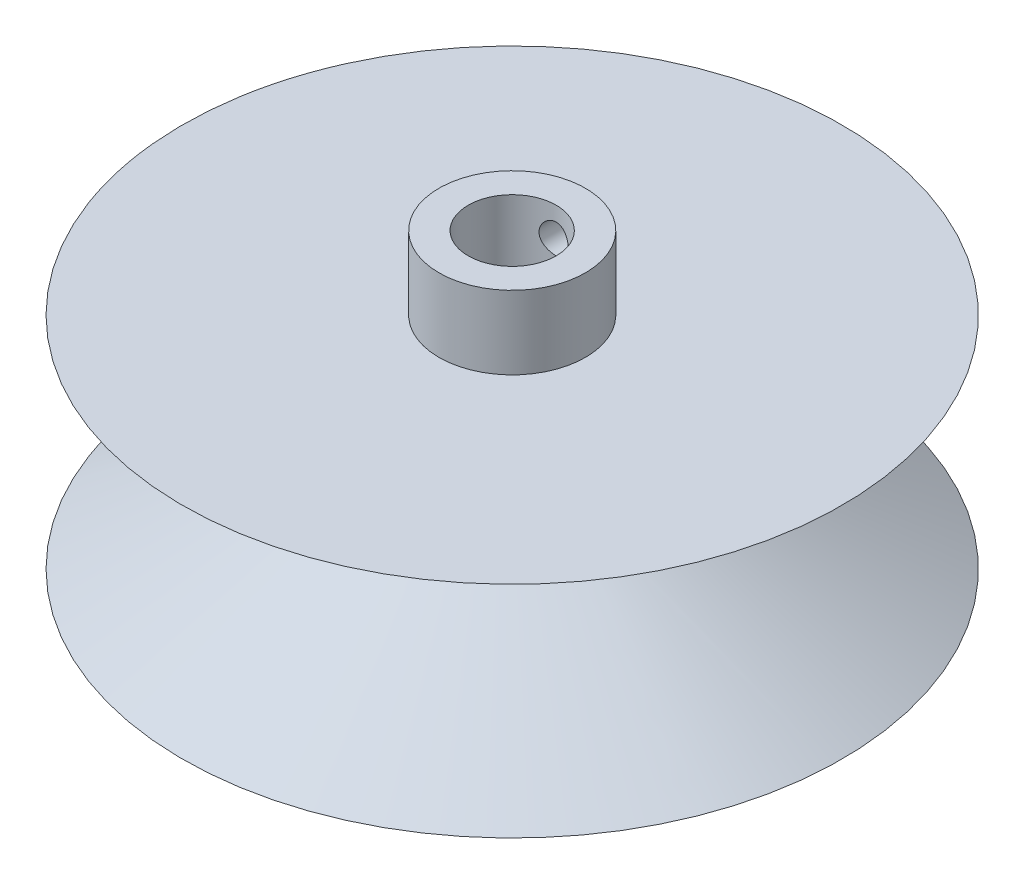
ISO-10303-21;
HEADER;
FILE_DESCRIPTION(('STEP AP214'),'2;1');
FILE_NAME('part.step','',(''),(''),'','','');
FILE_SCHEMA(('AUTOMOTIVE_DESIGN { 1 0 10303 214 1 1 1 1 }'));
ENDSEC;
DATA;
#1=APPLICATION_CONTEXT('core data for automotive mechanical design processes');
#2=APPLICATION_PROTOCOL_DEFINITION('international standard','automotive_design',2000,#1);
#3=PRODUCT_CONTEXT('',#1,'mechanical');
#4=PRODUCT('Part','Part','',(#3));
#5=PRODUCT_RELATED_PRODUCT_CATEGORY('part','',(#4));
#6=PRODUCT_DEFINITION_FORMATION('','',#4);
#7=PRODUCT_DEFINITION_CONTEXT('part definition',#1,'design');
#8=PRODUCT_DEFINITION('design','',#6,#7);
#9=PRODUCT_DEFINITION_SHAPE('','',#8);
#10=(LENGTH_UNIT() NAMED_UNIT(*) SI_UNIT(.MILLI.,.METRE.));
#11=(NAMED_UNIT(*) PLANE_ANGLE_UNIT() SI_UNIT($,.RADIAN.));
#12=(NAMED_UNIT(*) SI_UNIT($,.STERADIAN.) SOLID_ANGLE_UNIT());
#13=UNCERTAINTY_MEASURE_WITH_UNIT(LENGTH_MEASURE(1.E-05),#10,'distance_accuracy_value','');
#14=(GEOMETRIC_REPRESENTATION_CONTEXT(3) GLOBAL_UNCERTAINTY_ASSIGNED_CONTEXT((#13)) GLOBAL_UNIT_ASSIGNED_CONTEXT((#10,
#11,#12)) REPRESENTATION_CONTEXT('',''));
#15=CARTESIAN_POINT('',(0.,0.,0.));
#16=DIRECTION('',(0.,0.,1.));
#17=DIRECTION('',(1.,0.,0.));
#18=AXIS2_PLACEMENT_3D('',#15,#16,#17);
#19=CARTESIAN_POINT('',(0.,12.5,0.));
#20=DIRECTION('',(0.,-1.,0.));
#21=DIRECTION('',(0.,0.,-1.));
#22=AXIS2_PLACEMENT_3D('',#19,#20,#21);
#23=CYLINDRICAL_SURFACE('',#22,5.);
#24=CARTESIAN_POINT('',(0.,12.5,0.));
#25=DIRECTION('',(0.,1.,0.));
#26=DIRECTION('',(0.,0.,1.));
#27=AXIS2_PLACEMENT_3D('',#24,#25,#26);
#28=CIRCLE('',#27,5.);
#29=CARTESIAN_POINT('',(0.,12.5,5.));
#30=VERTEX_POINT('',#29);
#31=EDGE_CURVE('E62',#30,#30,#28,.T.);
#32=ORIENTED_EDGE('',*,*,#31,.F.);
#33=EDGE_LOOP('',(#32));
#34=FACE_BOUND('',#33,.T.);
#35=CARTESIAN_POINT('',(0.,7.5,0.));
#36=DIRECTION('',(0.,1.,0.));
#37=DIRECTION('',(0.,0.,1.));
#38=AXIS2_PLACEMENT_3D('',#35,#36,#37);
#39=CIRCLE('',#38,5.);
#40=CARTESIAN_POINT('',(0.,7.5,5.));
#41=VERTEX_POINT('',#40);
#42=EDGE_CURVE('E11',#41,#41,#39,.T.);
#43=ORIENTED_EDGE('',*,*,#42,.T.);
#44=EDGE_LOOP('',(#43));
#45=FACE_BOUND('',#44,.T.);
#46=CARTESIAN_POINT('',(-1.,10.5,-4.89897948556636));
#47=CARTESIAN_POINT('',(-0.999997945876046,10.444435624518,-4.89898059043933));
#48=CARTESIAN_POINT('',(-0.995353171723656,10.3888453766935,-4.89993508346913));
#49=CARTESIAN_POINT('',(-0.976912283588335,10.2792374948816,-4.90364431385263));
#50=CARTESIAN_POINT('',(-0.963108847071181,10.2252211553689,-4.90640049166333));
#51=CARTESIAN_POINT('',(-0.926795782617738,10.1203626966371,-4.91338873700356));
#52=CARTESIAN_POINT('',(-0.904294814152082,10.0695174784651,-4.91761933615313));
#53=CARTESIAN_POINT('',(-0.851249107671042,9.97232515530538,-4.92707799486421));
#54=CARTESIAN_POINT('',(-0.820704818601295,9.92597779946273,-4.93230599875014));
#55=CARTESIAN_POINT('',(-0.751979075653289,9.8384389961455,-4.9432529969268));
#56=CARTESIAN_POINT('',(-0.713705655913278,9.79732041211586,-4.94897737836825));
#57=CARTESIAN_POINT('',(-0.630806789021349,9.72204246642119,-4.9602247230302));
#58=CARTESIAN_POINT('',(-0.586180896977994,9.68788359258285,-4.96574767210945));
#59=CARTESIAN_POINT('',(-0.491361355924245,9.6272119823715,-4.97602796417448));
#60=CARTESIAN_POINT('',(-0.441122567672207,9.60076848618335,-4.9807782144152));
#61=CARTESIAN_POINT('',(-0.336804150387274,9.55672506295188,-4.98891736883662));
#62=CARTESIAN_POINT('',(-0.282724881420553,9.53912430809901,-4.99230640044127));
#63=CARTESIAN_POINT('',(-0.173016773278493,9.51349280638037,-4.9973032068841));
#64=CARTESIAN_POINT('',(-0.117417739214814,9.50533902242899,-4.99893386288125));
#65=CARTESIAN_POINT('',(-0.00561856843753626,9.49844904816169,-5.00030921183606));
#66=CARTESIAN_POINT('',(0.0505815098318433,9.49971195035418,-5.0000540865276));
#67=CARTESIAN_POINT('',(0.161142000743589,9.51152618021556,-4.99770434868515));
#68=CARTESIAN_POINT('',(0.21551721429847,9.52194497716785,-4.99563598365838));
#69=CARTESIAN_POINT('',(0.321731626580301,9.55156503245889,-4.98992177159409));
#70=CARTESIAN_POINT('',(0.37357072374713,9.57076664219187,-4.98627586144039));
#71=CARTESIAN_POINT('',(0.473619463200888,9.61753004014727,-4.97777296019958));
#72=CARTESIAN_POINT('',(0.5218041741339,9.64514375110489,-4.97290848175223));
#73=CARTESIAN_POINT('',(0.612905045859756,9.7079090772366,-4.96250469473785));
#74=CARTESIAN_POINT('',(0.655820599525001,9.74306155977052,-4.95696530855222));
#75=CARTESIAN_POINT('',(0.735951431053458,9.82063362210847,-4.9457096436446));
#76=CARTESIAN_POINT('',(0.773054316573632,9.86316918672959,-4.93999196457516));
#77=CARTESIAN_POINT('',(0.839618493176808,9.95391644245075,-4.92911571598761));
#78=CARTESIAN_POINT('',(0.869079639727751,10.0021282408832,-4.92395715704548));
#79=CARTESIAN_POINT('',(0.919562814801882,10.1030208318218,-4.91478047472924));
#80=CARTESIAN_POINT('',(0.940566647777709,10.1557109676397,-4.91076481563549));
#81=CARTESIAN_POINT('',(0.973390341627582,10.263971323724,-4.90436476321273));
#82=CARTESIAN_POINT('',(0.985211399456642,10.3195411676191,-4.90198015728428));
#83=CARTESIAN_POINT('',(0.999166006036051,10.430964857999,-4.89915479267828));
#84=CARTESIAN_POINT('',(1.00146185889791,10.4867975743103,-4.89868147057154));
#85=CARTESIAN_POINT('',(0.996737628310739,10.5980482231997,-4.89964485688854));
#86=CARTESIAN_POINT('',(0.989718073122443,10.6534661791189,-4.90108145700388));
#87=CARTESIAN_POINT('',(0.966702208074157,10.7617686402922,-4.90567232494914));
#88=CARTESIAN_POINT('',(0.950792620839298,10.8146723430358,-4.90880999014497));
#89=CARTESIAN_POINT('',(0.910541035308518,10.9170632790287,-4.91643489351665));
#90=CARTESIAN_POINT('',(0.886198342373177,10.9665502304357,-4.9209222428627));
#91=CARTESIAN_POINT('',(0.829404142215599,11.0614131099502,-4.93081405962039));
#92=CARTESIAN_POINT('',(0.796851077982754,11.1067270463008,-4.93622971864903));
#93=CARTESIAN_POINT('',(0.724695572212712,11.1913083120009,-4.94733723826636));
#94=CARTESIAN_POINT('',(0.685092405144537,11.2305750182493,-4.95302912723818));
#95=CARTESIAN_POINT('',(0.599232273497889,11.3025625591856,-4.96415345869216));
#96=CARTESIAN_POINT('',(0.552882498929628,11.33517365465,-4.96958057708684));
#97=CARTESIAN_POINT('',(0.455267896634754,11.3921458814996,-4.9794712762862));
#98=CARTESIAN_POINT('',(0.404003275433506,11.4165073593448,-4.98393489755211));
#99=CARTESIAN_POINT('',(0.298302680824012,11.4561288717466,-4.99137294061067));
#100=CARTESIAN_POINT('',(0.243886673478077,11.4714405182263,-4.99435579142604));
#101=CARTESIAN_POINT('',(0.133189454679912,11.4926912476638,-4.9985323593766));
#102=CARTESIAN_POINT('',(0.0769084687112137,11.4986314594757,-4.99972629199843));
#103=CARTESIAN_POINT('',(-0.0348728939036238,11.5009269809629,-5.00018540454121));
#104=CARTESIAN_POINT('',(-0.0903698121415029,11.4974472804562,-4.99948378549351));
#105=CARTESIAN_POINT('',(-0.199971031315642,11.4813660494522,-4.99630043560318));
#106=CARTESIAN_POINT('',(-0.254075349753692,11.4687646336519,-4.99381872714351));
#107=CARTESIAN_POINT('',(-0.359252749745097,11.4348710079084,-4.98735498365001));
#108=CARTESIAN_POINT('',(-0.410332443240281,11.4135986218688,-4.98337637247912));
#109=CARTESIAN_POINT('',(-0.508221220185953,11.3629877586691,-4.97434722123382));
#110=CARTESIAN_POINT('',(-0.555029965767412,11.3336486440963,-4.96929659645878));
#111=CARTESIAN_POINT('',(-0.643863890106358,11.2671806129379,-4.95857599157868));
#112=CARTESIAN_POINT('',(-0.685799716116503,11.2299336636132,-4.95289733422142));
#113=CARTESIAN_POINT('',(-0.762882617756846,11.1489497599042,-4.94161222903622));
#114=CARTESIAN_POINT('',(-0.798028083202712,11.1052112705313,-4.93600579862875));
#115=CARTESIAN_POINT('',(-0.860892219455201,11.0119206832998,-4.92543342749964));
#116=CARTESIAN_POINT('',(-0.888526814639768,10.9623110388396,-4.92047503631328));
#117=CARTESIAN_POINT('',(-0.935024049287809,10.8590672267003,-4.91185237184445));
#118=CARTESIAN_POINT('',(-0.95389464597929,10.8054367613021,-4.90818692536957));
#119=CARTESIAN_POINT('',(-0.978669139854273,10.7097375445634,-4.90329681128922));
#120=CARTESIAN_POINT('',(-0.986653898522986,10.6682145804885,-4.90168784915661));
#121=CARTESIAN_POINT('',(-0.997320017960409,10.5844660454464,-4.8995287845803));
#122=CARTESIAN_POINT('',(-1.00000156156205,10.5422404987518,-4.89897864563277));
#123=CARTESIAN_POINT('',(-1.,10.5,-4.89897948556636));
#124=B_SPLINE_CURVE_WITH_KNOTS('',3,(#46,#47,#48,#49,#50,#51,#52,#53,#54,#55,#56,#57,#58,#59,
#60,#61,#62,#63,#64,#65,#66,#67,#68,#69,#70,#71,#72,#73,#74,#75,#76,#77,#78,#79,#80,#81,#82,#83,
#84,#85,#86,#87,#88,#89,#90,#91,#92,#93,#94,#95,#96,#97,#98,#99,#100,#101,#102,#103,#104,#105,
#106,#107,#108,#109,#110,#111,#112,#113,#114,#115,#116,#117,#118,#119,#120,#121,#122,#123),
.UNSPECIFIED.,.T.,.F.,(4,2,2,2,2,2,2,2,2,2,2,2,2,2,2,2,2,2,2,2,2,2,2,2,2,2,2,2,2,2,2,2,2,2,2,2,
2,2,4),(0.,0.166538463856523,0.333210239259265,0.499716497915556,0.666213464834831,
0.834822525459336,1.00344340032919,1.17353400434947,1.34360868244057,1.51144248880577,
1.67926012113745,1.84468789631034,2.01012229071247,2.176599242198,2.34309535767563,
2.5124934675998,2.68189478120217,2.85165863170273,3.02140035013521,3.1882375780209,
3.35506534525918,3.52029341780816,3.68553510351895,3.85293059772018,4.02034332867706,
4.19032601730948,4.36030156627602,4.52929813576147,4.69827434689125,4.86431017412183,
5.03034391364254,5.19600017072949,5.36166952132181,5.53001152023093,5.69839338887278,
5.86858898576538,6.0386297508643,6.16523803634393,6.29184195681712),.UNSPECIFIED.);
#125=CARTESIAN_POINT('',(-1.,10.5,-4.89897948556636));
#126=VERTEX_POINT('',#125);
#127=EDGE_CURVE('E182',#126,#126,#124,.T.);
#128=ORIENTED_EDGE('',*,*,#127,.T.);
#129=EDGE_LOOP('',(#128));
#130=FACE_BOUND('',#129,.T.);
#131=ADVANCED_FACE('F43',(#34,#45,#130),#23,.T.);
#132=CARTESIAN_POINT('',(0.,-15.9852813742386,0.));
#133=DIRECTION('',(0.,1.,0.));
#134=DIRECTION('',(0.,0.,1.));
#135=AXIS2_PLACEMENT_3D('',#132,#133,#134);
#136=CYLINDRICAL_SURFACE('',#135,3.);
#137=CARTESIAN_POINT('',(0.,12.5,0.));
#138=DIRECTION('',(0.,1.,0.));
#139=DIRECTION('',(0.,0.,1.));
#140=AXIS2_PLACEMENT_3D('',#137,#138,#139);
#141=CIRCLE('',#140,3.);
#142=CARTESIAN_POINT('',(0.,12.5,3.));
#143=VERTEX_POINT('',#142);
#144=EDGE_CURVE('E189',#143,#143,#141,.T.);
#145=ORIENTED_EDGE('',*,*,#144,.T.);
#146=EDGE_LOOP('',(#145));
#147=FACE_BOUND('',#146,.T.);
#148=CARTESIAN_POINT('',(0.,-7.5,0.));
#149=DIRECTION('',(0.,-1.,0.));
#150=DIRECTION('',(0.,0.,-1.));
#151=AXIS2_PLACEMENT_3D('',#148,#149,#150);
#152=CIRCLE('',#151,3.);
#153=CARTESIAN_POINT('',(0.,-7.5,-3.));
#154=VERTEX_POINT('',#153);
#155=EDGE_CURVE('E216',#154,#154,#152,.F.);
#156=ORIENTED_EDGE('',*,*,#155,.F.);
#157=EDGE_LOOP('',(#156));
#158=FACE_BOUND('',#157,.T.);
#159=CARTESIAN_POINT('',(-1.,10.5,-2.82842712474619));
#160=CARTESIAN_POINT('',(-1.0000002579478,10.5544681748107,-2.82842694532735));
#161=CARTESIAN_POINT('',(-0.99553478369814,10.6089347997715,-2.83001769372806));
#162=CARTESIAN_POINT('',(-0.977851131702564,10.7162544209506,-2.8361757417458));
#163=CARTESIAN_POINT('',(-0.964631512170673,10.7691071498639,-2.8407435316722));
#164=CARTESIAN_POINT('',(-0.929955485680263,10.8716268930128,-2.85228203663888));
#165=CARTESIAN_POINT('',(-0.908515221402,10.9212999294469,-2.8592480396464));
#166=CARTESIAN_POINT('',(-0.858061628442627,11.0163600485438,-2.87479122017008));
#167=CARTESIAN_POINT('',(-0.829046628860523,11.0617461825525,-2.88336875305432));
#168=CARTESIAN_POINT('',(-0.763051146442526,11.1487199623395,-2.90154489405589));
#169=CARTESIAN_POINT('',(-0.725824341377824,11.190115428672,-2.91116894844139));
#170=CARTESIAN_POINT('',(-0.644987667214489,11.2662068012243,-2.93013864801508));
#171=CARTESIAN_POINT('',(-0.601376775052402,11.3009016315823,-2.93948424829099));
#172=CARTESIAN_POINT('',(-0.507604507964985,11.3634788973297,-2.95713866921658));
#173=CARTESIAN_POINT('',(-0.457301911224519,11.391159970618,-2.96541407701568));
#174=CARTESIAN_POINT('',(-0.352431222987482,11.4375915851275,-2.9796958677102));
#175=CARTESIAN_POINT('',(-0.297864285687215,11.4563445331769,-2.98570286203012));
#176=CARTESIAN_POINT('',(-0.188028817433493,11.4837358546324,-2.99459075431897));
#177=CARTESIAN_POINT('',(-0.132850754852968,11.492703446257,-2.99757314777558));
#178=CARTESIAN_POINT('',(-0.0216978748240917,11.5013162933607,-3.00043608218249));
#179=CARTESIAN_POINT('',(0.034276733543892,11.5009639516524,-3.00031742262891));
#180=CARTESIAN_POINT('',(0.143103515193816,11.491155745434,-2.99706039618736));
#181=CARTESIAN_POINT('',(0.195992048591666,11.4820574715255,-2.99404064755135));
#182=CARTESIAN_POINT('',(0.29944343882216,11.4556070190195,-2.98546967339714));
#183=CARTESIAN_POINT('',(0.350006137779175,11.4382542810202,-2.97991827631115));
#184=CARTESIAN_POINT('',(0.448152474842013,11.3955786826939,-2.96675670293292));
#185=CARTESIAN_POINT('',(0.495688220968998,11.3701540614532,-2.9591204252427));
#186=CARTESIAN_POINT('',(0.585924325527169,11.3121402945516,-2.94258393038665));
#187=CARTESIAN_POINT('',(0.628623334384769,11.2795491566734,-2.93368336200518));
#188=CARTESIAN_POINT('',(0.710100866551907,11.2063256065393,-2.9150619185089));
#189=CARTESIAN_POINT('',(0.748600157067556,11.1653868421546,-2.90532215172667));
#190=CARTESIAN_POINT('',(0.818277259595889,11.0775512742773,-2.88647335245111));
#191=CARTESIAN_POINT('',(0.849453943273005,11.0306535542868,-2.8773644173145));
#192=CARTESIAN_POINT('',(0.903987455042732,10.9313463743846,-2.86070525135531));
#193=CARTESIAN_POINT('',(0.927226463651049,10.8788678686322,-2.85317909338821));
#194=CARTESIAN_POINT('',(0.964443193299506,10.7704286057337,-2.84081650878299));
#195=CARTESIAN_POINT('',(0.978424795755529,10.7144693187782,-2.83597895501223));
#196=CARTESIAN_POINT('',(0.996161282090474,10.6033616445994,-2.8297963630207));
#197=CARTESIAN_POINT('',(1.00034909550575,10.5482905752543,-2.82830360315139));
#198=CARTESIAN_POINT('',(0.999605438911605,10.438223850883,-2.828566720628));
#199=CARTESIAN_POINT('',(0.99467562522726,10.3832281839752,-2.83032200792768));
#200=CARTESIAN_POINT('',(0.976225651551831,10.2768430342888,-2.83673618089379));
#201=CARTESIAN_POINT('',(0.963006393980556,10.2253945698494,-2.84129325440593));
#202=CARTESIAN_POINT('',(0.928713862560597,10.1254563937606,-2.8526855367127));
#203=CARTESIAN_POINT('',(0.907639196363458,10.0769672084092,-2.85952114934907));
#204=CARTESIAN_POINT('',(0.857474340738902,9.98261957915306,-2.87496877595718));
#205=CARTESIAN_POINT('',(0.828151118358489,9.93689335735822,-2.8836302566561));
#206=CARTESIAN_POINT('',(0.76258563055757,9.85085394761627,-2.90165768730984));
#207=CARTESIAN_POINT('',(0.726341325498786,9.81054236133878,-2.91102384443799));
#208=CARTESIAN_POINT('',(0.645891705900324,9.73447201590937,-2.92995038637844));
#209=CARTESIAN_POINT('',(0.601387270546653,9.69902560998115,-2.93949843577895));
#210=CARTESIAN_POINT('',(0.506827291400259,9.63608385765196,-2.9572685161311));
#211=CARTESIAN_POINT('',(0.456771944864553,9.60858822883758,-2.96549059417695));
#212=CARTESIAN_POINT('',(0.352779862432296,9.56257989513829,-2.97964405810603));
#213=CARTESIAN_POINT('',(0.298871123321197,9.54400872285194,-2.98559030004531));
#214=CARTESIAN_POINT('',(0.188458465846017,9.5162722579399,-2.99458610837774));
#215=CARTESIAN_POINT('',(0.131955491953891,9.5071035701195,-2.99763672034018));
#216=CARTESIAN_POINT('',(0.0208153358600424,9.49873792239436,-3.00041863236257));
#217=CARTESIAN_POINT('',(-0.0337847239200173,9.49909254606762,-3.00029920089441));
#218=CARTESIAN_POINT('',(-0.142111145000172,9.50865730814641,-2.99712196519396));
#219=CARTESIAN_POINT('',(-0.195837576819054,9.51786672815276,-2.99406439933567));
#220=CARTESIAN_POINT('',(-0.300042119432059,9.54458223457597,-2.98540914954421));
#221=CARTESIAN_POINT('',(-0.350558270912794,9.56195421535295,-2.9798525836118));
#222=CARTESIAN_POINT('',(-0.447978350939788,9.60437753109714,-2.96677160704464));
#223=CARTESIAN_POINT('',(-0.494881624142408,9.62943025519694,-2.95924684047901));
#224=CARTESIAN_POINT('',(-0.585634016308808,9.68756951210208,-2.94265868828001));
#225=CARTESIAN_POINT('',(-0.629306251557695,9.72091868538192,-2.93354872492381));
#226=CARTESIAN_POINT('',(-0.710581026272337,9.79425739115591,-2.91492988791425));
#227=CARTESIAN_POINT('',(-0.748181621624258,9.83424904226168,-2.90542088771397));
#228=CARTESIAN_POINT('',(-0.817741808833463,9.92160935558804,-2.88663279827365));
#229=CARTESIAN_POINT('',(-0.849422965999216,9.96920551098077,-2.87737727995345));
#230=CARTESIAN_POINT('',(-0.9043143432998,10.0693344268987,-2.86060193316303));
#231=CARTESIAN_POINT('',(-0.927526776814559,10.1218658930142,-2.8530816513617));
#232=CARTESIAN_POINT('',(-0.963843828206627,10.2279618240238,-2.84101334230535));
#233=CARTESIAN_POINT('',(-0.977357909163268,10.2813722635657,-2.83634632944799));
#234=CARTESIAN_POINT('',(-0.995434320161694,10.3898560505155,-2.83005383613939));
#235=CARTESIAN_POINT('',(-0.999999739196502,10.4449288174358,-2.82842730615135));
#236=CARTESIAN_POINT('',(-1.,10.5,-2.82842712474619));
#237=B_SPLINE_CURVE_WITH_KNOTS('',3,(#159,#160,#161,#162,#163,#164,#165,#166,#167,#168,#169,
#170,#171,#172,#173,#174,#175,#176,#177,#178,#179,#180,#181,#182,#183,#184,#185,#186,#187,#188,
#189,#190,#191,#192,#193,#194,#195,#196,#197,#198,#199,#200,#201,#202,#203,#204,#205,#206,#207,
#208,#209,#210,#211,#212,#213,#214,#215,#216,#217,#218,#219,#220,#221,#222,#223,#224,#225,#226,
#227,#228,#229,#230,#231,#232,#233,#234,#235,#236),.UNSPECIFIED.,.T.,.F.,(4,2,2,2,2,2,2,2,2,2,2,
2,2,2,2,2,2,2,2,2,2,2,2,2,2,2,2,2,2,2,2,2,2,2,2,2,2,2,4),(0.,0.163200584775417,0.32642805496888,
0.489336627454545,0.652281166139158,0.8210133742294,0.989772651673595,1.16293506139029,
1.33605076382161,1.50314318760306,1.67019253297699,1.83069004820941,1.99119844184608,
2.15381654855707,2.31647991869394,2.48680174359289,2.65714979607478,2.82992639837376,
3.00263051349688,3.16754291357512,3.33242535830307,3.49164395761849,3.65089079140018,
3.81518857728787,3.979534856552,4.15178808164165,4.32403518750605,4.49513791183924,
4.66617882997229,4.82918084670708,4.99216964002854,5.15256956033503,5.31299850756315,
5.47935519513706,5.64576504425704,5.81868902729217,5.9915677825994,6.15663212153686,
6.32163947179229),.UNSPECIFIED.);
#238=CARTESIAN_POINT('',(-1.,10.5,-2.82842712474619));
#239=VERTEX_POINT('',#238);
#240=EDGE_CURVE('E185',#239,#239,#237,.T.);
#241=ORIENTED_EDGE('',*,*,#240,.T.);
#242=EDGE_LOOP('',(#241));
#243=FACE_BOUND('',#242,.T.);
#244=ADVANCED_FACE('F166',(#147,#158,#243),#136,.F.);
#245=CARTESIAN_POINT('',(0.,7.5,0.));
#246=DIRECTION('',(0.,1.,0.));
#247=DIRECTION('',(0.,0.,1.));
#248=AXIS2_PLACEMENT_3D('',#245,#246,#247);
#249=PLANE('',#248);
#250=ORIENTED_EDGE('',*,*,#42,.F.);
#251=EDGE_LOOP('',(#250));
#252=FACE_BOUND('',#251,.T.);
#253=CARTESIAN_POINT('',(0.,7.5,0.));
#254=DIRECTION('',(0.,1.,0.));
#255=DIRECTION('',(0.,0.,1.));
#256=AXIS2_PLACEMENT_3D('',#253,#254,#255);
#257=CIRCLE('',#256,22.5);
#258=CARTESIAN_POINT('',(22.4879917336535,7.5,0.735001896004284));
#259=VERTEX_POINT('',#258);
#260=EDGE_CURVE('E53',#259,#259,#257,.T.);
#261=ORIENTED_EDGE('',*,*,#260,.T.);
#262=EDGE_LOOP('',(#261));
#263=FACE_BOUND('',#262,.T.);
#264=ADVANCED_FACE('F45',(#252,#263),#249,.T.);
#265=CARTESIAN_POINT('',(9.91667001103588,0.,2.59271207275735));
#266=CARTESIAN_POINT('',(22.4879917336535,7.5,0.735001896004284));
#267=CARTESIAN_POINT('',(15.1020941565506,0.,-17.2406279493144));
#268=CARTESIAN_POINT('',(23.9579955256621,7.5,-44.2409815713028));
#269=CARTESIAN_POINT('',(-4.73124586552117,0.,-22.4260520948291));
#270=CARTESIAN_POINT('',(-21.017987941645,7.5,-45.7109853633114));
#271=CARTESIAN_POINT('',(-9.91667001103587,0.,-2.59271207275735));
#272=CARTESIAN_POINT('',(-22.4879917336535,7.5,-0.735001896004292));
#273=CARTESIAN_POINT('',(-15.1020941565506,0.,17.2406279493144));
#274=CARTESIAN_POINT('',(-23.9579955256621,7.5,44.2409815713028));
#275=CARTESIAN_POINT('',(4.73124586552117,0.,22.4260520948291));
#276=CARTESIAN_POINT('',(21.017987941645,7.5,45.7109853633114));
#277=CARTESIAN_POINT('',(9.91667001103588,0.,2.59271207275735));
#278=CARTESIAN_POINT('',(22.4879917336535,7.5,0.735001896004284));
#279=(BOUNDED_SURFACE() B_SPLINE_SURFACE(3,1,((#265,#266),(#267,#268),(#269,#270),(#271,#272),
(#273,#274),(#275,#276),(#277,#278)),.UNSPECIFIED.,.T.,.F.,.F.) B_SPLINE_SURFACE_WITH_KNOTS((4,
3,4),(2,2),(0.,0.5,1.),(0.,1.),
.UNSPECIFIED.) GEOMETRIC_REPRESENTATION_ITEM() RATIONAL_B_SPLINE_SURFACE(((1.,1.),
(0.333333333333334,0.333333333333333),(0.333333333333334,0.333333333333333),(1.,1.),
(0.333333333333333,0.333333333333333),(0.333333333333333,0.333333333333333),(1.,1.))) REPRESENTATION_ITEM('') SURFACE());
#280=CARTESIAN_POINT('',(0.,0.,0.));
#281=DIRECTION('',(0.,1.,0.));
#282=DIRECTION('',(0.,0.,1.));
#283=AXIS2_PLACEMENT_3D('',#280,#281,#282);
#284=CIRCLE('',#283,10.25);
#285=CARTESIAN_POINT('',(9.91667001103588,0.,2.59271207275735));
#286=VERTEX_POINT('',#285);
#287=EDGE_CURVE('E68',#286,#286,#284,.T.);
#288=CARTESIAN_POINT('',(9.91667001103588,0.,2.59271207275735));
#289=CARTESIAN_POINT('',(10.0476212789798,0.0781249999999992,2.57336092508284));
#290=CARTESIAN_POINT('',(10.1785725469237,0.156249999999999,2.55400977740832));
#291=CARTESIAN_POINT('',(10.4404750828116,0.3125,2.5153074820593));
#292=CARTESIAN_POINT('',(10.5714263507555,0.390625,2.49595633438479));
#293=CARTESIAN_POINT('',(10.8333288866434,0.546875,2.45725403903577));
#294=CARTESIAN_POINT('',(10.9642801545873,0.625,2.43790289136126));
#295=CARTESIAN_POINT('',(11.2261826904752,0.78125,2.39920059601224));
#296=CARTESIAN_POINT('',(11.3571339584191,0.859375,2.37984944833772));
#297=CARTESIAN_POINT('',(11.619036494307,1.015625,2.3411471529887));
#298=CARTESIAN_POINT('',(11.749987762251,1.09375,2.32179600531419));
#299=CARTESIAN_POINT('',(12.0118902981388,1.25,2.28309370996517));
#300=CARTESIAN_POINT('',(12.1428415660828,1.328125,2.26374256229066));
#301=CARTESIAN_POINT('',(12.4047441019706,1.484375,2.22504026694164));
#302=CARTESIAN_POINT('',(12.5356953699146,1.5625,2.20568911926713));
#303=CARTESIAN_POINT('',(12.7975979058024,1.71875,2.1669868239181));
#304=CARTESIAN_POINT('',(12.9285491737464,1.796875,2.14763567624359));
#305=CARTESIAN_POINT('',(13.1904517096342,1.953125,2.10893338089457));
#306=CARTESIAN_POINT('',(13.3214029775782,2.03125,2.08958223322006));
#307=CARTESIAN_POINT('',(13.583305513466,2.1875,2.05087993787104));
#308=CARTESIAN_POINT('',(13.71425678141,2.265625,2.03152879019653));
#309=CARTESIAN_POINT('',(13.9761593172978,2.421875,1.9928264948475));
#310=CARTESIAN_POINT('',(14.1071105852418,2.5,1.97347534717299));
#311=CARTESIAN_POINT('',(14.3690131211296,2.65625,1.93477305182397));
#312=CARTESIAN_POINT('',(14.4999643890736,2.734375,1.91542190414946));
#313=CARTESIAN_POINT('',(14.7618669249614,2.890625,1.87671960880044));
#314=CARTESIAN_POINT('',(14.8928181929054,2.96875,1.85736846112593));
#315=CARTESIAN_POINT('',(15.1547207287932,3.125,1.8186661657769));
#316=CARTESIAN_POINT('',(15.2856719967372,3.203125,1.79931501810239));
#317=CARTESIAN_POINT('',(15.547574532625,3.359375,1.76061272275337));
#318=CARTESIAN_POINT('',(15.678525800569,3.4375,1.74126157507886));
#319=CARTESIAN_POINT('',(15.9404283364568,3.59375,1.70255927972984));
#320=CARTESIAN_POINT('',(16.0713796044008,3.671875,1.68320813205533));
#321=CARTESIAN_POINT('',(16.3332821402886,3.828125,1.6445058367063));
#322=CARTESIAN_POINT('',(16.4642334082326,3.90625,1.62515468903179));
#323=CARTESIAN_POINT('',(16.7261359441204,4.0625,1.58645239368277));
#324=CARTESIAN_POINT('',(16.8570872120644,4.140625,1.56710124600826));
#325=CARTESIAN_POINT('',(17.1189897479522,4.296875,1.52839895065924));
#326=CARTESIAN_POINT('',(17.2499410158962,4.375,1.50904780298473));
#327=CARTESIAN_POINT('',(17.5118435517841,4.53125,1.4703455076357));
#328=CARTESIAN_POINT('',(17.642794819728,4.609375,1.45099435996119));
#329=CARTESIAN_POINT('',(17.9046973556159,4.765625,1.41229206461217));
#330=CARTESIAN_POINT('',(18.0356486235598,4.84375,1.39294091693766));
#331=CARTESIAN_POINT('',(18.2975511594477,5.,1.35423862158864));
#332=CARTESIAN_POINT('',(18.4285024273916,5.078125,1.33488747391413));
#333=CARTESIAN_POINT('',(18.6904049632795,5.234375,1.2961851785651));
#334=CARTESIAN_POINT('',(18.8213562312234,5.3125,1.27683403089059));
#335=CARTESIAN_POINT('',(19.0832587671113,5.46875,1.23813173554157));
#336=CARTESIAN_POINT('',(19.2142100350552,5.546875,1.21878058786706));
#337=CARTESIAN_POINT('',(19.4761125709431,5.703125,1.18007829251804));
#338=CARTESIAN_POINT('',(19.607063838887,5.78125,1.16072714484353));
#339=CARTESIAN_POINT('',(19.8689663747749,5.9375,1.12202484949451));
#340=CARTESIAN_POINT('',(19.9999176427188,6.015625,1.10267370181999));
#341=CARTESIAN_POINT('',(20.2618201786067,6.171875,1.06397140647097));
#342=CARTESIAN_POINT('',(20.3927714465506,6.25,1.04462025879646));
#343=CARTESIAN_POINT('',(20.6546739824385,6.40625,1.00591796344744));
#344=CARTESIAN_POINT('',(20.7856252503824,6.484375,0.986566815772928));
#345=CARTESIAN_POINT('',(21.0475277862703,6.640625,0.947864520423906));
#346=CARTESIAN_POINT('',(21.1784790542142,6.71875,0.928513372749395));
#347=CARTESIAN_POINT('',(21.4403815901021,6.875,0.889811077400373));
#348=CARTESIAN_POINT('',(21.571332858046,6.953125,0.870459929725862));
#349=CARTESIAN_POINT('',(21.8332353939339,7.109375,0.831757634376839));
#350=CARTESIAN_POINT('',(21.9641866618778,7.1875,0.812406486702328));
#351=CARTESIAN_POINT('',(22.2260891977657,7.34375,0.773704191353306));
#352=CARTESIAN_POINT('',(22.3570404657096,7.421875,0.754353043678795));
#353=CARTESIAN_POINT('',(22.4879917336535,7.5,0.735001896004284));
#354=B_SPLINE_CURVE_WITH_KNOTS('',3,(#288,#289,#290,#291,#292,#293,#294,#295,#296,#297,#298,
#299,#300,#301,#302,#303,#304,#305,#306,#307,#308,#309,#310,#311,#312,#313,#314,#315,#316,#317,
#318,#319,#320,#321,#322,#323,#324,#325,#326,#327,#328,#329,#330,#331,#332,#333,#334,#335,#336,
#337,#338,#339,#340,#341,#342,#343,#344,#345,#346,#347,#348,#349,#350,#351,#352,#353),
.UNSPECIFIED.,.F.,.F.,(4,2,2,2,2,2,2,2,2,2,2,2,2,2,2,2,2,2,2,2,2,2,2,2,2,2,2,2,2,2,2,2,4),(0.,
0.461124662165237,0.922249324330471,1.38337398649571,1.84449864866094,2.30562331082618,
2.76674797299142,3.22787263515665,3.68899729732189,4.15012195948712,4.61124662165236,
5.07237128381759,5.53349594598283,5.99462060814806,6.4557452703133,6.91686993247854,
7.37799459464377,7.83911925680901,8.30024391897424,8.76136858113948,9.22249324330472,
9.68361790546995,10.1447425676352,10.6058672298004,11.0669918919657,11.5281165541309,
11.9892412162961,12.4503658784614,12.9114905406266,13.3726152027918,13.8337398649571,
14.2948645271223,14.7559891892875),.UNSPECIFIED.);
#355=EDGE_CURVE('BSEAM131',#286,#259,#354,.T.);
#356=ORIENTED_EDGE('',*,*,#287,.T.);
#357=ORIENTED_EDGE('',*,*,#260,.F.);
#358=ORIENTED_EDGE('',*,*,#355,.T.);
#359=ORIENTED_EDGE('',*,*,#355,.F.);
#360=EDGE_LOOP('',(#356,#358,#357,#359));
#361=FACE_BOUND('',#360,.T.);
#362=ADVANCED_FACE('F131',(#361),#279,.T.);
#363=CARTESIAN_POINT('',(0.,-7.5,0.));
#364=DIRECTION('',(0.,-1.,0.));
#365=DIRECTION('',(0.,0.,1.));
#366=AXIS2_PLACEMENT_3D('',#363,#364,#365);
#367=PLANE('',#366);
#368=ORIENTED_EDGE('',*,*,#155,.T.);
#369=EDGE_LOOP('',(#368));
#370=FACE_BOUND('',#369,.T.);
#371=CARTESIAN_POINT('',(0.,-7.5,0.));
#372=DIRECTION('',(0.,1.,0.));
#373=DIRECTION('',(0.,0.,1.));
#374=AXIS2_PLACEMENT_3D('',#371,#372,#373);
#375=CIRCLE('',#374,22.5);
#376=CARTESIAN_POINT('',(22.4879917336535,-7.5,0.735001896004284));
#377=VERTEX_POINT('',#376);
#378=EDGE_CURVE('E59',#377,#377,#375,.T.);
#379=ORIENTED_EDGE('',*,*,#378,.F.);
#380=EDGE_LOOP('',(#379));
#381=FACE_BOUND('',#380,.T.);
#382=ADVANCED_FACE('F88',(#370,#381),#367,.T.);
#383=CARTESIAN_POINT('',(9.91667001103588,0.,2.59271207275735));
#384=CARTESIAN_POINT('',(22.4879917336535,-7.5,0.735001896004284));
#385=CARTESIAN_POINT('',(15.1020941565506,0.,-17.2406279493144));
#386=CARTESIAN_POINT('',(23.9579955256621,-7.5,-44.2409815713028));
#387=CARTESIAN_POINT('',(-4.73124586552117,0.,-22.4260520948291));
#388=CARTESIAN_POINT('',(-21.017987941645,-7.5,-45.7109853633114));
#389=CARTESIAN_POINT('',(-9.91667001103587,0.,-2.59271207275735));
#390=CARTESIAN_POINT('',(-22.4879917336535,-7.5,-0.735001896004292));
#391=CARTESIAN_POINT('',(-15.1020941565506,0.,17.2406279493144));
#392=CARTESIAN_POINT('',(-23.9579955256621,-7.5,44.2409815713028));
#393=CARTESIAN_POINT('',(4.73124586552117,0.,22.4260520948291));
#394=CARTESIAN_POINT('',(21.017987941645,-7.5,45.7109853633114));
#395=CARTESIAN_POINT('',(9.91667001103588,0.,2.59271207275735));
#396=CARTESIAN_POINT('',(22.4879917336535,-7.5,0.735001896004284));
#397=(BOUNDED_SURFACE() B_SPLINE_SURFACE(3,1,((#383,#384),(#385,#386),(#387,#388),(#389,#390),
(#391,#392),(#393,#394),(#395,#396)),.UNSPECIFIED.,.T.,.F.,.F.) B_SPLINE_SURFACE_WITH_KNOTS((4,
3,4),(2,2),(0.,0.5,1.),(0.,1.),
.UNSPECIFIED.) GEOMETRIC_REPRESENTATION_ITEM() RATIONAL_B_SPLINE_SURFACE(((1.,1.),
(0.333333333333334,0.333333333333333),(0.333333333333334,0.333333333333333),(1.,1.),
(0.333333333333333,0.333333333333333),(0.333333333333333,0.333333333333333),(1.,1.))) REPRESENTATION_ITEM('') SURFACE());
#398=CARTESIAN_POINT('',(9.91667001103588,0.,2.59271207275735));
#399=CARTESIAN_POINT('',(10.0476212789798,-0.0781249999999992,2.57336092508284));
#400=CARTESIAN_POINT('',(10.1785725469237,-0.156249999999999,2.55400977740832));
#401=CARTESIAN_POINT('',(10.4404750828116,-0.3125,2.5153074820593));
#402=CARTESIAN_POINT('',(10.5714263507555,-0.390625,2.49595633438479));
#403=CARTESIAN_POINT('',(10.8333288866434,-0.546875,2.45725403903577));
#404=CARTESIAN_POINT('',(10.9642801545873,-0.625,2.43790289136126));
#405=CARTESIAN_POINT('',(11.2261826904752,-0.78125,2.39920059601224));
#406=CARTESIAN_POINT('',(11.3571339584191,-0.859375,2.37984944833772));
#407=CARTESIAN_POINT('',(11.619036494307,-1.015625,2.3411471529887));
#408=CARTESIAN_POINT('',(11.749987762251,-1.09375,2.32179600531419));
#409=CARTESIAN_POINT('',(12.0118902981388,-1.25,2.28309370996517));
#410=CARTESIAN_POINT('',(12.1428415660828,-1.328125,2.26374256229066));
#411=CARTESIAN_POINT('',(12.4047441019706,-1.484375,2.22504026694164));
#412=CARTESIAN_POINT('',(12.5356953699146,-1.5625,2.20568911926713));
#413=CARTESIAN_POINT('',(12.7975979058024,-1.71875,2.1669868239181));
#414=CARTESIAN_POINT('',(12.9285491737464,-1.796875,2.14763567624359));
#415=CARTESIAN_POINT('',(13.1904517096342,-1.953125,2.10893338089457));
#416=CARTESIAN_POINT('',(13.3214029775782,-2.03125,2.08958223322006));
#417=CARTESIAN_POINT('',(13.583305513466,-2.1875,2.05087993787104));
#418=CARTESIAN_POINT('',(13.71425678141,-2.265625,2.03152879019653));
#419=CARTESIAN_POINT('',(13.9761593172978,-2.421875,1.9928264948475));
#420=CARTESIAN_POINT('',(14.1071105852418,-2.5,1.97347534717299));
#421=CARTESIAN_POINT('',(14.3690131211296,-2.65625,1.93477305182397));
#422=CARTESIAN_POINT('',(14.4999643890736,-2.734375,1.91542190414946));
#423=CARTESIAN_POINT('',(14.7618669249614,-2.890625,1.87671960880044));
#424=CARTESIAN_POINT('',(14.8928181929054,-2.96875,1.85736846112593));
#425=CARTESIAN_POINT('',(15.1547207287932,-3.125,1.8186661657769));
#426=CARTESIAN_POINT('',(15.2856719967372,-3.203125,1.79931501810239));
#427=CARTESIAN_POINT('',(15.547574532625,-3.359375,1.76061272275337));
#428=CARTESIAN_POINT('',(15.678525800569,-3.4375,1.74126157507886));
#429=CARTESIAN_POINT('',(15.9404283364568,-3.59375,1.70255927972984));
#430=CARTESIAN_POINT('',(16.0713796044008,-3.671875,1.68320813205533));
#431=CARTESIAN_POINT('',(16.3332821402886,-3.828125,1.6445058367063));
#432=CARTESIAN_POINT('',(16.4642334082326,-3.90625,1.62515468903179));
#433=CARTESIAN_POINT('',(16.7261359441204,-4.0625,1.58645239368277));
#434=CARTESIAN_POINT('',(16.8570872120644,-4.140625,1.56710124600826));
#435=CARTESIAN_POINT('',(17.1189897479522,-4.296875,1.52839895065924));
#436=CARTESIAN_POINT('',(17.2499410158962,-4.375,1.50904780298473));
#437=CARTESIAN_POINT('',(17.5118435517841,-4.53125,1.4703455076357));
#438=CARTESIAN_POINT('',(17.642794819728,-4.609375,1.45099435996119));
#439=CARTESIAN_POINT('',(17.9046973556159,-4.765625,1.41229206461217));
#440=CARTESIAN_POINT('',(18.0356486235598,-4.84375,1.39294091693766));
#441=CARTESIAN_POINT('',(18.2975511594477,-5.,1.35423862158864));
#442=CARTESIAN_POINT('',(18.4285024273916,-5.078125,1.33488747391413));
#443=CARTESIAN_POINT('',(18.6904049632795,-5.234375,1.2961851785651));
#444=CARTESIAN_POINT('',(18.8213562312234,-5.3125,1.27683403089059));
#445=CARTESIAN_POINT('',(19.0832587671113,-5.46875,1.23813173554157));
#446=CARTESIAN_POINT('',(19.2142100350552,-5.546875,1.21878058786706));
#447=CARTESIAN_POINT('',(19.4761125709431,-5.703125,1.18007829251804));
#448=CARTESIAN_POINT('',(19.607063838887,-5.78125,1.16072714484353));
#449=CARTESIAN_POINT('',(19.8689663747749,-5.9375,1.12202484949451));
#450=CARTESIAN_POINT('',(19.9999176427188,-6.015625,1.10267370181999));
#451=CARTESIAN_POINT('',(20.2618201786067,-6.171875,1.06397140647097));
#452=CARTESIAN_POINT('',(20.3927714465506,-6.25,1.04462025879646));
#453=CARTESIAN_POINT('',(20.6546739824385,-6.40625,1.00591796344744));
#454=CARTESIAN_POINT('',(20.7856252503824,-6.484375,0.986566815772928));
#455=CARTESIAN_POINT('',(21.0475277862703,-6.640625,0.947864520423906));
#456=CARTESIAN_POINT('',(21.1784790542142,-6.71875,0.928513372749395));
#457=CARTESIAN_POINT('',(21.4403815901021,-6.875,0.889811077400373));
#458=CARTESIAN_POINT('',(21.571332858046,-6.953125,0.870459929725862));
#459=CARTESIAN_POINT('',(21.8332353939339,-7.109375,0.831757634376839));
#460=CARTESIAN_POINT('',(21.9641866618778,-7.1875,0.812406486702328));
#461=CARTESIAN_POINT('',(22.2260891977657,-7.34375,0.773704191353306));
#462=CARTESIAN_POINT('',(22.3570404657096,-7.421875,0.754353043678795));
#463=CARTESIAN_POINT('',(22.4879917336535,-7.5,0.735001896004284));
#464=B_SPLINE_CURVE_WITH_KNOTS('',3,(#398,#399,#400,#401,#402,#403,#404,#405,#406,#407,#408,
#409,#410,#411,#412,#413,#414,#415,#416,#417,#418,#419,#420,#421,#422,#423,#424,#425,#426,#427,
#428,#429,#430,#431,#432,#433,#434,#435,#436,#437,#438,#439,#440,#441,#442,#443,#444,#445,#446,
#447,#448,#449,#450,#451,#452,#453,#454,#455,#456,#457,#458,#459,#460,#461,#462,#463),
.UNSPECIFIED.,.F.,.F.,(4,2,2,2,2,2,2,2,2,2,2,2,2,2,2,2,2,2,2,2,2,2,2,2,2,2,2,2,2,2,2,2,4),(0.,
0.461124662165237,0.922249324330471,1.38337398649571,1.84449864866094,2.30562331082618,
2.76674797299142,3.22787263515665,3.68899729732189,4.15012195948712,4.61124662165236,
5.07237128381759,5.53349594598283,5.99462060814806,6.4557452703133,6.91686993247854,
7.37799459464377,7.83911925680901,8.30024391897424,8.76136858113948,9.22249324330472,
9.68361790546995,10.1447425676352,10.6058672298004,11.0669918919657,11.5281165541309,
11.9892412162961,12.4503658784614,12.9114905406266,13.3726152027918,13.8337398649571,
14.2948645271223,14.7559891892875),.UNSPECIFIED.);
#465=EDGE_CURVE('BSEAM75',#286,#377,#464,.T.);
#466=ORIENTED_EDGE('',*,*,#287,.F.);
#467=ORIENTED_EDGE('',*,*,#378,.T.);
#468=ORIENTED_EDGE('',*,*,#465,.T.);
#469=ORIENTED_EDGE('',*,*,#465,.F.);
#470=EDGE_LOOP('',(#466,#468,#467,#469));
#471=FACE_BOUND('',#470,.T.);
#472=ADVANCED_FACE('F75',(#471),#397,.F.);
#473=CARTESIAN_POINT('',(0.,12.5,0.));
#474=DIRECTION('',(0.,1.,0.));
#475=DIRECTION('',(0.,0.,1.));
#476=AXIS2_PLACEMENT_3D('',#473,#474,#475);
#477=PLANE('',#476);
#478=ORIENTED_EDGE('',*,*,#144,.F.);
#479=EDGE_LOOP('',(#478));
#480=FACE_BOUND('',#479,.T.);
#481=ORIENTED_EDGE('',*,*,#31,.T.);
#482=EDGE_LOOP('',(#481));
#483=FACE_BOUND('',#482,.T.);
#484=ADVANCED_FACE('F87',(#480,#483),#477,.T.);
#485=CARTESIAN_POINT('',(0.,10.5,22.9790129976564));
#486=DIRECTION('',(0.,0.,-1.));
#487=DIRECTION('',(-1.,0.,0.));
#488=AXIS2_PLACEMENT_3D('',#485,#486,#487);
#489=CYLINDRICAL_SURFACE('',#488,1.);
#490=ORIENTED_EDGE('',*,*,#240,.F.);
#491=EDGE_LOOP('',(#490));
#492=FACE_BOUND('',#491,.T.);
#493=ORIENTED_EDGE('',*,*,#127,.F.);
#494=EDGE_LOOP('',(#493));
#495=FACE_BOUND('',#494,.T.);
#496=ADVANCED_FACE('F201',(#492,#495),#489,.F.);
#497=CLOSED_SHELL('',(#131,#244,#264,#362,#382,#472,#484,#496));
#498=MANIFOLD_SOLID_BREP('B2',#497);
#499=ADVANCED_BREP_SHAPE_REPRESENTATION('',(#18,#498),#14);
#500=SHAPE_DEFINITION_REPRESENTATION(#9,#499);
ENDSEC;
END-ISO-10303-21;
